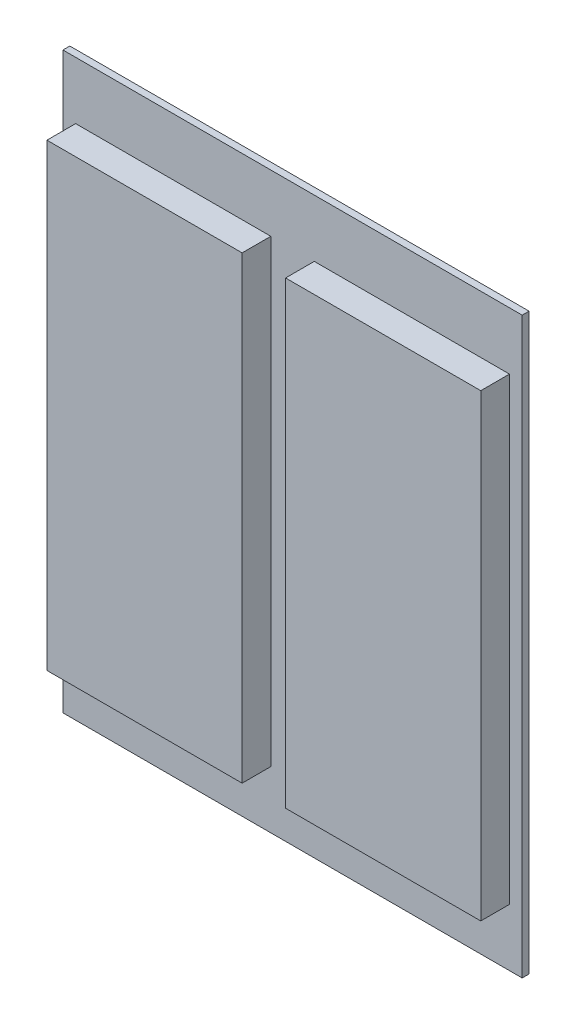
ISO-10303-21;
HEADER;
FILE_DESCRIPTION(('STEP AP214'),'2;1');
FILE_NAME('part.step','',(''),(''),'','','');
FILE_SCHEMA(('AUTOMOTIVE_DESIGN { 1 0 10303 214 1 1 1 1 }'));
ENDSEC;
DATA;
#1=APPLICATION_CONTEXT('core data for automotive mechanical design processes');
#2=APPLICATION_PROTOCOL_DEFINITION('international standard','automotive_design',2000,#1);
#3=PRODUCT_CONTEXT('',#1,'mechanical');
#4=PRODUCT('Part','Part','',(#3));
#5=PRODUCT_RELATED_PRODUCT_CATEGORY('part','',(#4));
#6=PRODUCT_DEFINITION_FORMATION('','',#4);
#7=PRODUCT_DEFINITION_CONTEXT('part definition',#1,'design');
#8=PRODUCT_DEFINITION('design','',#6,#7);
#9=PRODUCT_DEFINITION_SHAPE('','',#8);
#10=(LENGTH_UNIT() NAMED_UNIT(*) SI_UNIT(.MILLI.,.METRE.));
#11=(NAMED_UNIT(*) PLANE_ANGLE_UNIT() SI_UNIT($,.RADIAN.));
#12=(NAMED_UNIT(*) SI_UNIT($,.STERADIAN.) SOLID_ANGLE_UNIT());
#13=UNCERTAINTY_MEASURE_WITH_UNIT(LENGTH_MEASURE(1.E-05),#10,'distance_accuracy_value','');
#14=(GEOMETRIC_REPRESENTATION_CONTEXT(3) GLOBAL_UNCERTAINTY_ASSIGNED_CONTEXT((#13)) GLOBAL_UNIT_ASSIGNED_CONTEXT((#10,
#11,#12)) REPRESENTATION_CONTEXT('',''));
#15=CARTESIAN_POINT('',(0.,0.,0.));
#16=DIRECTION('',(0.,0.,1.));
#17=DIRECTION('',(1.,0.,0.));
#18=AXIS2_PLACEMENT_3D('',#15,#16,#17);
#19=CARTESIAN_POINT('',(0.,0.,7.874));
#20=DIRECTION('',(0.,0.,1.));
#21=DIRECTION('',(1.,0.,0.));
#22=AXIS2_PLACEMENT_3D('',#19,#20,#21);
#23=PLANE('',#22);
#24=DIRECTION('',(0.,1.,0.));
#25=VECTOR('',#24,1.);
#26=CARTESIAN_POINT('',(47.9888689746924,-50.8,7.874));
#27=LINE('',#26,#25);
#28=CARTESIAN_POINT('',(47.9888689746924,50.8,7.874));
#29=VERTEX_POINT('',#28);
#30=CARTESIAN_POINT('',(47.9888689746924,-50.8,7.874));
#31=VERTEX_POINT('',#30);
#32=EDGE_CURVE('E20',#29,#31,#27,.F.);
#33=ORIENTED_EDGE('',*,*,#32,.F.);
#34=DIRECTION('',(1.,0.,0.));
#35=VECTOR('',#34,1.);
#36=CARTESIAN_POINT('',(47.9888689746924,50.8,7.874));
#37=LINE('',#36,#35);
#38=CARTESIAN_POINT('',(4.80886897469239,50.8,7.874));
#39=VERTEX_POINT('',#38);
#40=EDGE_CURVE('E129',#39,#29,#37,.T.);
#41=ORIENTED_EDGE('',*,*,#40,.F.);
#42=DIRECTION('',(0.,1.,0.));
#43=VECTOR('',#42,1.);
#44=CARTESIAN_POINT('',(4.80886897469239,50.8,7.874));
#45=LINE('',#44,#43);
#46=CARTESIAN_POINT('',(4.80886897469239,-50.8,7.874));
#47=VERTEX_POINT('',#46);
#48=EDGE_CURVE('E120',#47,#39,#45,.T.);
#49=ORIENTED_EDGE('',*,*,#48,.F.);
#50=DIRECTION('',(1.,0.,0.));
#51=VECTOR('',#50,1.);
#52=CARTESIAN_POINT('',(4.80886897469239,-50.8,7.874));
#53=LINE('',#52,#51);
#54=EDGE_CURVE('E103',#31,#47,#53,.F.);
#55=ORIENTED_EDGE('',*,*,#54,.F.);
#56=EDGE_LOOP('',(#33,#41,#49,#55));
#57=FACE_BOUND('',#56,.T.);
#58=ADVANCED_FACE('F17',(#57),#23,.T.);
#59=CARTESIAN_POINT('',(0.,0.,7.874));
#60=DIRECTION('',(0.,0.,1.));
#61=DIRECTION('',(1.,0.,0.));
#62=AXIS2_PLACEMENT_3D('',#59,#60,#61);
#63=PLANE('',#62);
#64=DIRECTION('',(0.,1.,0.));
#65=VECTOR('',#64,1.);
#66=CARTESIAN_POINT('',(-4.80886897469239,-50.8,7.874));
#67=LINE('',#66,#65);
#68=CARTESIAN_POINT('',(-4.80886897469239,50.8,7.874));
#69=VERTEX_POINT('',#68);
#70=CARTESIAN_POINT('',(-4.8088689746924,-50.8,7.874));
#71=VERTEX_POINT('',#70);
#72=EDGE_CURVE('E132',#69,#71,#67,.F.);
#73=ORIENTED_EDGE('',*,*,#72,.F.);
#74=DIRECTION('',(1.,0.,0.));
#75=VECTOR('',#74,1.);
#76=CARTESIAN_POINT('',(-4.80886897469239,50.8,7.874));
#77=LINE('',#76,#75);
#78=CARTESIAN_POINT('',(-47.9888689746924,50.8,7.874));
#79=VERTEX_POINT('',#78);
#80=EDGE_CURVE('E147',#79,#69,#77,.T.);
#81=ORIENTED_EDGE('',*,*,#80,.F.);
#82=DIRECTION('',(0.,1.,0.));
#83=VECTOR('',#82,1.);
#84=CARTESIAN_POINT('',(-47.9888689746924,50.8,7.874));
#85=LINE('',#84,#83);
#86=CARTESIAN_POINT('',(-47.9888689746924,-50.8,7.874));
#87=VERTEX_POINT('',#86);
#88=EDGE_CURVE('E142',#87,#79,#85,.T.);
#89=ORIENTED_EDGE('',*,*,#88,.F.);
#90=DIRECTION('',(1.,0.,0.));
#91=VECTOR('',#90,1.);
#92=CARTESIAN_POINT('',(-47.9888689746924,-50.8,7.874));
#93=LINE('',#92,#91);
#94=EDGE_CURVE('E137',#71,#87,#93,.F.);
#95=ORIENTED_EDGE('',*,*,#94,.F.);
#96=EDGE_LOOP('',(#73,#81,#89,#95));
#97=FACE_BOUND('',#96,.T.);
#98=ADVANCED_FACE('F253',(#97),#63,.T.);
#99=CARTESIAN_POINT('',(47.9888689746924,-50.8,1.524));
#100=DIRECTION('',(1.,0.,0.));
#101=DIRECTION('',(0.,0.,-1.));
#102=AXIS2_PLACEMENT_3D('',#99,#100,#101);
#103=PLANE('',#102);
#104=DIRECTION('',(0.,0.,-1.));
#105=VECTOR('',#104,1.);
#106=CARTESIAN_POINT('',(47.9888689746924,-50.8,1.524));
#107=LINE('',#106,#105);
#108=CARTESIAN_POINT('',(47.9888689746924,-50.8,1.524));
#109=VERTEX_POINT('',#108);
#110=EDGE_CURVE('E112',#109,#31,#107,.F.);
#111=ORIENTED_EDGE('',*,*,#110,.F.);
#112=DIRECTION('',(0.,1.,0.));
#113=VECTOR('',#112,1.);
#114=CARTESIAN_POINT('',(47.9888689746924,0.,1.524));
#115=LINE('',#114,#113);
#116=CARTESIAN_POINT('',(47.9888689746924,50.8,1.524));
#117=VERTEX_POINT('',#116);
#118=EDGE_CURVE('E151',#117,#109,#115,.F.);
#119=ORIENTED_EDGE('',*,*,#118,.F.);
#120=DIRECTION('',(0.,0.,1.));
#121=VECTOR('',#120,1.);
#122=CARTESIAN_POINT('',(47.9888689746924,50.8,1.524));
#123=LINE('',#122,#121);
#124=EDGE_CURVE('E114',#29,#117,#123,.F.);
#125=ORIENTED_EDGE('',*,*,#124,.F.);
#126=ORIENTED_EDGE('',*,*,#32,.T.);
#127=EDGE_LOOP('',(#111,#119,#125,#126));
#128=FACE_BOUND('',#127,.T.);
#129=ADVANCED_FACE('F110',(#128),#103,.T.);
#130=CARTESIAN_POINT('',(4.80886897469239,-50.8,1.524));
#131=DIRECTION('',(0.,-1.,0.));
#132=DIRECTION('',(0.,0.,-1.));
#133=AXIS2_PLACEMENT_3D('',#130,#131,#132);
#134=PLANE('',#133);
#135=DIRECTION('',(0.,0.,1.));
#136=VECTOR('',#135,1.);
#137=CARTESIAN_POINT('',(4.80886897469239,-50.8,1.524));
#138=LINE('',#137,#136);
#139=CARTESIAN_POINT('',(4.80886897469239,-50.8,1.524));
#140=VERTEX_POINT('',#139);
#141=EDGE_CURVE('E121',#140,#47,#138,.T.);
#142=ORIENTED_EDGE('',*,*,#141,.F.);
#143=DIRECTION('',(1.,0.,0.));
#144=VECTOR('',#143,1.);
#145=CARTESIAN_POINT('',(0.,-50.8,1.524));
#146=LINE('',#145,#144);
#147=EDGE_CURVE('E118',#109,#140,#146,.F.);
#148=ORIENTED_EDGE('',*,*,#147,.F.);
#149=ORIENTED_EDGE('',*,*,#110,.T.);
#150=ORIENTED_EDGE('',*,*,#54,.T.);
#151=EDGE_LOOP('',(#142,#148,#149,#150));
#152=FACE_BOUND('',#151,.T.);
#153=ADVANCED_FACE('F117',(#152),#134,.T.);
#154=CARTESIAN_POINT('',(4.80886897469239,50.8,1.524));
#155=DIRECTION('',(-1.,0.,0.));
#156=DIRECTION('',(0.,0.,1.));
#157=AXIS2_PLACEMENT_3D('',#154,#155,#156);
#158=PLANE('',#157);
#159=DIRECTION('',(0.,0.,1.));
#160=VECTOR('',#159,1.);
#161=CARTESIAN_POINT('',(4.8088689746924,50.8,1.524));
#162=LINE('',#161,#160);
#163=CARTESIAN_POINT('',(4.80886897469239,50.8,1.524));
#164=VERTEX_POINT('',#163);
#165=EDGE_CURVE('E126',#164,#39,#162,.T.);
#166=ORIENTED_EDGE('',*,*,#165,.F.);
#167=DIRECTION('',(0.,1.,0.));
#168=VECTOR('',#167,1.);
#169=CARTESIAN_POINT('',(4.80886897469239,0.,1.524));
#170=LINE('',#169,#168);
#171=EDGE_CURVE('E154',#140,#164,#170,.T.);
#172=ORIENTED_EDGE('',*,*,#171,.F.);
#173=ORIENTED_EDGE('',*,*,#141,.T.);
#174=ORIENTED_EDGE('',*,*,#48,.T.);
#175=EDGE_LOOP('',(#166,#172,#173,#174));
#176=FACE_BOUND('',#175,.T.);
#177=ADVANCED_FACE('F245',(#176),#158,.T.);
#178=CARTESIAN_POINT('',(47.9888689746924,50.8,1.524));
#179=DIRECTION('',(0.,1.,0.));
#180=DIRECTION('',(0.,0.,1.));
#181=AXIS2_PLACEMENT_3D('',#178,#179,#180);
#182=PLANE('',#181);
#183=ORIENTED_EDGE('',*,*,#124,.T.);
#184=DIRECTION('',(1.,0.,0.));
#185=VECTOR('',#184,1.);
#186=CARTESIAN_POINT('',(0.,50.8,1.524));
#187=LINE('',#186,#185);
#188=EDGE_CURVE('E156',#164,#117,#187,.T.);
#189=ORIENTED_EDGE('',*,*,#188,.F.);
#190=ORIENTED_EDGE('',*,*,#165,.T.);
#191=ORIENTED_EDGE('',*,*,#40,.T.);
#192=EDGE_LOOP('',(#183,#189,#190,#191));
#193=FACE_BOUND('',#192,.T.);
#194=ADVANCED_FACE('F241',(#193),#182,.T.);
#195=CARTESIAN_POINT('',(-4.80886897469239,-50.8,1.524));
#196=DIRECTION('',(1.,0.,0.));
#197=DIRECTION('',(0.,0.,-1.));
#198=AXIS2_PLACEMENT_3D('',#195,#196,#197);
#199=PLANE('',#198);
#200=DIRECTION('',(0.,0.,-1.));
#201=VECTOR('',#200,1.);
#202=CARTESIAN_POINT('',(-4.8088689746924,-50.8,1.524));
#203=LINE('',#202,#201);
#204=CARTESIAN_POINT('',(-4.8088689746924,-50.8,1.524));
#205=VERTEX_POINT('',#204);
#206=EDGE_CURVE('E134',#205,#71,#203,.F.);
#207=ORIENTED_EDGE('',*,*,#206,.F.);
#208=DIRECTION('',(0.,1.,0.));
#209=VECTOR('',#208,1.);
#210=CARTESIAN_POINT('',(-4.80886897469239,0.,1.524));
#211=LINE('',#210,#209);
#212=CARTESIAN_POINT('',(-4.80886897469239,50.8,1.524));
#213=VERTEX_POINT('',#212);
#214=EDGE_CURVE('E159',#213,#205,#211,.F.);
#215=ORIENTED_EDGE('',*,*,#214,.F.);
#216=DIRECTION('',(0.,0.,1.));
#217=VECTOR('',#216,1.);
#218=CARTESIAN_POINT('',(-4.80886897469239,50.8,1.524));
#219=LINE('',#218,#217);
#220=EDGE_CURVE('E149',#69,#213,#219,.F.);
#221=ORIENTED_EDGE('',*,*,#220,.F.);
#222=ORIENTED_EDGE('',*,*,#72,.T.);
#223=EDGE_LOOP('',(#207,#215,#221,#222));
#224=FACE_BOUND('',#223,.T.);
#225=ADVANCED_FACE('F237',(#224),#199,.T.);
#226=CARTESIAN_POINT('',(-47.9888689746924,-50.8,1.524));
#227=DIRECTION('',(0.,-1.,0.));
#228=DIRECTION('',(0.,0.,-1.));
#229=AXIS2_PLACEMENT_3D('',#226,#227,#228);
#230=PLANE('',#229);
#231=DIRECTION('',(0.,0.,1.));
#232=VECTOR('',#231,1.);
#233=CARTESIAN_POINT('',(-47.9888689746924,-50.8,1.524));
#234=LINE('',#233,#232);
#235=CARTESIAN_POINT('',(-47.9888689746924,-50.8,1.524));
#236=VERTEX_POINT('',#235);
#237=EDGE_CURVE('E139',#236,#87,#234,.T.);
#238=ORIENTED_EDGE('',*,*,#237,.F.);
#239=DIRECTION('',(1.,0.,0.));
#240=VECTOR('',#239,1.);
#241=CARTESIAN_POINT('',(0.,-50.8,1.524));
#242=LINE('',#241,#240);
#243=EDGE_CURVE('E161',#205,#236,#242,.F.);
#244=ORIENTED_EDGE('',*,*,#243,.F.);
#245=ORIENTED_EDGE('',*,*,#206,.T.);
#246=ORIENTED_EDGE('',*,*,#94,.T.);
#247=EDGE_LOOP('',(#238,#244,#245,#246));
#248=FACE_BOUND('',#247,.T.);
#249=ADVANCED_FACE('F233',(#248),#230,.T.);
#250=CARTESIAN_POINT('',(-47.9888689746924,50.8,1.524));
#251=DIRECTION('',(-1.,0.,0.));
#252=DIRECTION('',(0.,0.,1.));
#253=AXIS2_PLACEMENT_3D('',#250,#251,#252);
#254=PLANE('',#253);
#255=DIRECTION('',(0.,0.,1.));
#256=VECTOR('',#255,1.);
#257=CARTESIAN_POINT('',(-47.9888689746924,50.8,1.524));
#258=LINE('',#257,#256);
#259=CARTESIAN_POINT('',(-47.9888689746924,50.8,1.524));
#260=VERTEX_POINT('',#259);
#261=EDGE_CURVE('E144',#260,#79,#258,.T.);
#262=ORIENTED_EDGE('',*,*,#261,.F.);
#263=DIRECTION('',(0.,1.,0.));
#264=VECTOR('',#263,1.);
#265=CARTESIAN_POINT('',(-47.9888689746924,0.,1.524));
#266=LINE('',#265,#264);
#267=EDGE_CURVE('E163',#236,#260,#266,.T.);
#268=ORIENTED_EDGE('',*,*,#267,.F.);
#269=ORIENTED_EDGE('',*,*,#237,.T.);
#270=ORIENTED_EDGE('',*,*,#88,.T.);
#271=EDGE_LOOP('',(#262,#268,#269,#270));
#272=FACE_BOUND('',#271,.T.);
#273=ADVANCED_FACE('F229',(#272),#254,.T.);
#274=CARTESIAN_POINT('',(-4.80886897469239,50.8,1.524));
#275=DIRECTION('',(0.,1.,0.));
#276=DIRECTION('',(0.,0.,1.));
#277=AXIS2_PLACEMENT_3D('',#274,#275,#276);
#278=PLANE('',#277);
#279=ORIENTED_EDGE('',*,*,#220,.T.);
#280=DIRECTION('',(1.,0.,0.));
#281=VECTOR('',#280,1.);
#282=CARTESIAN_POINT('',(0.,50.8,1.524));
#283=LINE('',#282,#281);
#284=EDGE_CURVE('E165',#260,#213,#283,.T.);
#285=ORIENTED_EDGE('',*,*,#284,.F.);
#286=ORIENTED_EDGE('',*,*,#261,.T.);
#287=ORIENTED_EDGE('',*,*,#80,.T.);
#288=EDGE_LOOP('',(#279,#285,#286,#287));
#289=FACE_BOUND('',#288,.T.);
#290=ADVANCED_FACE('F225',(#289),#278,.T.);
#291=CARTESIAN_POINT('',(0.,0.,1.524));
#292=DIRECTION('',(0.,0.,1.));
#293=DIRECTION('',(1.,0.,0.));
#294=AXIS2_PLACEMENT_3D('',#291,#292,#293);
#295=PLANE('',#294);
#296=ORIENTED_EDGE('',*,*,#267,.T.);
#297=ORIENTED_EDGE('',*,*,#284,.T.);
#298=ORIENTED_EDGE('',*,*,#214,.T.);
#299=ORIENTED_EDGE('',*,*,#243,.T.);
#300=EDGE_LOOP('',(#296,#297,#298,#299));
#301=FACE_BOUND('',#300,.T.);
#302=ORIENTED_EDGE('',*,*,#171,.T.);
#303=ORIENTED_EDGE('',*,*,#188,.T.);
#304=ORIENTED_EDGE('',*,*,#118,.T.);
#305=ORIENTED_EDGE('',*,*,#147,.T.);
#306=EDGE_LOOP('',(#302,#303,#304,#305));
#307=FACE_BOUND('',#306,.T.);
#308=DIRECTION('',(1.,0.,0.));
#309=VECTOR('',#308,1.);
#310=CARTESIAN_POINT('',(50.8,63.5,1.524));
#311=LINE('',#310,#309);
#312=CARTESIAN_POINT('',(-50.8,63.5,1.524));
#313=VERTEX_POINT('',#312);
#314=CARTESIAN_POINT('',(50.8,63.5,1.524));
#315=VERTEX_POINT('',#314);
#316=EDGE_CURVE('E181',#313,#315,#311,.T.);
#317=ORIENTED_EDGE('',*,*,#316,.F.);
#318=DIRECTION('',(0.,1.,0.));
#319=VECTOR('',#318,1.);
#320=CARTESIAN_POINT('',(-50.8,63.5,1.524));
#321=LINE('',#320,#319);
#322=CARTESIAN_POINT('',(-50.8,-63.5,1.524));
#323=VERTEX_POINT('',#322);
#324=EDGE_CURVE('E168',#323,#313,#321,.T.);
#325=ORIENTED_EDGE('',*,*,#324,.F.);
#326=DIRECTION('',(1.,0.,0.));
#327=VECTOR('',#326,1.);
#328=CARTESIAN_POINT('',(-50.8,-63.5,1.524));
#329=LINE('',#328,#327);
#330=CARTESIAN_POINT('',(50.8,-63.5,1.524));
#331=VERTEX_POINT('',#330);
#332=EDGE_CURVE('E170',#331,#323,#329,.F.);
#333=ORIENTED_EDGE('',*,*,#332,.F.);
#334=DIRECTION('',(0.,1.,0.));
#335=VECTOR('',#334,1.);
#336=CARTESIAN_POINT('',(50.8,-63.5,1.524));
#337=LINE('',#336,#335);
#338=EDGE_CURVE('E174',#315,#331,#337,.F.);
#339=ORIENTED_EDGE('',*,*,#338,.F.);
#340=EDGE_LOOP('',(#317,#325,#333,#339));
#341=FACE_BOUND('',#340,.T.);
#342=ADVANCED_FACE('F222',(#301,#307,#341),#295,.T.);
#343=CARTESIAN_POINT('',(-50.8,63.5,0.));
#344=DIRECTION('',(-1.,0.,0.));
#345=DIRECTION('',(0.,0.,1.));
#346=AXIS2_PLACEMENT_3D('',#343,#344,#345);
#347=PLANE('',#346);
#348=DIRECTION('',(0.,0.,1.));
#349=VECTOR('',#348,1.);
#350=CARTESIAN_POINT('',(-50.8,63.5,0.));
#351=LINE('',#350,#349);
#352=CARTESIAN_POINT('',(-50.8,63.5,0.));
#353=VERTEX_POINT('',#352);
#354=EDGE_CURVE('E178',#353,#313,#351,.T.);
#355=ORIENTED_EDGE('',*,*,#354,.F.);
#356=DIRECTION('',(0.,1.,0.));
#357=VECTOR('',#356,1.);
#358=CARTESIAN_POINT('',(-50.8,0.,0.));
#359=LINE('',#358,#357);
#360=CARTESIAN_POINT('',(-50.8,-63.5,0.));
#361=VERTEX_POINT('',#360);
#362=EDGE_CURVE('E184',#353,#361,#359,.F.);
#363=ORIENTED_EDGE('',*,*,#362,.T.);
#364=DIRECTION('',(0.,0.,-1.));
#365=VECTOR('',#364,1.);
#366=CARTESIAN_POINT('',(-50.8,-63.5,0.));
#367=LINE('',#366,#365);
#368=EDGE_CURVE('E172',#323,#361,#367,.T.);
#369=ORIENTED_EDGE('',*,*,#368,.F.);
#370=ORIENTED_EDGE('',*,*,#324,.T.);
#371=EDGE_LOOP('',(#355,#363,#369,#370));
#372=FACE_BOUND('',#371,.T.);
#373=ADVANCED_FACE('F205',(#372),#347,.T.);
#374=CARTESIAN_POINT('',(-50.8,-63.5,0.));
#375=DIRECTION('',(0.,-1.,0.));
#376=DIRECTION('',(0.,0.,-1.));
#377=AXIS2_PLACEMENT_3D('',#374,#375,#376);
#378=PLANE('',#377);
#379=ORIENTED_EDGE('',*,*,#368,.T.);
#380=DIRECTION('',(1.,0.,0.));
#381=VECTOR('',#380,1.);
#382=CARTESIAN_POINT('',(0.,-63.5,0.));
#383=LINE('',#382,#381);
#384=CARTESIAN_POINT('',(50.8,-63.5,0.));
#385=VERTEX_POINT('',#384);
#386=EDGE_CURVE('E187',#361,#385,#383,.T.);
#387=ORIENTED_EDGE('',*,*,#386,.T.);
#388=DIRECTION('',(0.,0.,-1.));
#389=VECTOR('',#388,1.);
#390=CARTESIAN_POINT('',(50.8,-63.5,0.));
#391=LINE('',#390,#389);
#392=EDGE_CURVE('E176',#331,#385,#391,.T.);
#393=ORIENTED_EDGE('',*,*,#392,.F.);
#394=ORIENTED_EDGE('',*,*,#332,.T.);
#395=EDGE_LOOP('',(#379,#387,#393,#394));
#396=FACE_BOUND('',#395,.T.);
#397=ADVANCED_FACE('F199',(#396),#378,.T.);
#398=CARTESIAN_POINT('',(50.8,-63.5,0.));
#399=DIRECTION('',(1.,0.,0.));
#400=DIRECTION('',(0.,0.,-1.));
#401=AXIS2_PLACEMENT_3D('',#398,#399,#400);
#402=PLANE('',#401);
#403=ORIENTED_EDGE('',*,*,#392,.T.);
#404=DIRECTION('',(0.,1.,0.));
#405=VECTOR('',#404,1.);
#406=CARTESIAN_POINT('',(50.8,0.,0.));
#407=LINE('',#406,#405);
#408=CARTESIAN_POINT('',(50.8,63.5,0.));
#409=VERTEX_POINT('',#408);
#410=EDGE_CURVE('E26',#385,#409,#407,.T.);
#411=ORIENTED_EDGE('',*,*,#410,.T.);
#412=DIRECTION('',(0.,0.,1.));
#413=VECTOR('',#412,1.);
#414=CARTESIAN_POINT('',(50.8,63.5,0.));
#415=LINE('',#414,#413);
#416=EDGE_CURVE('E34',#315,#409,#415,.F.);
#417=ORIENTED_EDGE('',*,*,#416,.F.);
#418=ORIENTED_EDGE('',*,*,#338,.T.);
#419=EDGE_LOOP('',(#403,#411,#417,#418));
#420=FACE_BOUND('',#419,.T.);
#421=ADVANCED_FACE('F193',(#420),#402,.T.);
#422=CARTESIAN_POINT('',(50.8,63.5,0.));
#423=DIRECTION('',(0.,1.,0.));
#424=DIRECTION('',(0.,0.,1.));
#425=AXIS2_PLACEMENT_3D('',#422,#423,#424);
#426=PLANE('',#425);
#427=ORIENTED_EDGE('',*,*,#416,.T.);
#428=DIRECTION('',(1.,0.,0.));
#429=VECTOR('',#428,1.);
#430=CARTESIAN_POINT('',(0.,63.5,0.));
#431=LINE('',#430,#429);
#432=EDGE_CURVE('E11',#409,#353,#431,.F.);
#433=ORIENTED_EDGE('',*,*,#432,.T.);
#434=ORIENTED_EDGE('',*,*,#354,.T.);
#435=ORIENTED_EDGE('',*,*,#316,.T.);
#436=EDGE_LOOP('',(#427,#433,#434,#435));
#437=FACE_BOUND('',#436,.T.);
#438=ADVANCED_FACE('F207',(#437),#426,.T.);
#439=CARTESIAN_POINT('',(0.,0.,0.));
#440=DIRECTION('',(0.,0.,1.));
#441=DIRECTION('',(1.,0.,0.));
#442=AXIS2_PLACEMENT_3D('',#439,#440,#441);
#443=PLANE('',#442);
#444=ORIENTED_EDGE('',*,*,#410,.F.);
#445=ORIENTED_EDGE('',*,*,#386,.F.);
#446=ORIENTED_EDGE('',*,*,#362,.F.);
#447=ORIENTED_EDGE('',*,*,#432,.F.);
#448=EDGE_LOOP('',(#444,#445,#446,#447));
#449=FACE_BOUND('',#448,.T.);
#450=ADVANCED_FACE('F197',(#449),#443,.F.);
#451=CLOSED_SHELL('',(#58,#98,#129,#153,#177,#194,#225,#249,#273,#290,#342,#373,#397,#421,#438,#450));
#452=MANIFOLD_SOLID_BREP('B1',#451);
#453=ADVANCED_BREP_SHAPE_REPRESENTATION('',(#18,#452),#14);
#454=SHAPE_DEFINITION_REPRESENTATION(#9,#453);
ENDSEC;
END-ISO-10303-21;
